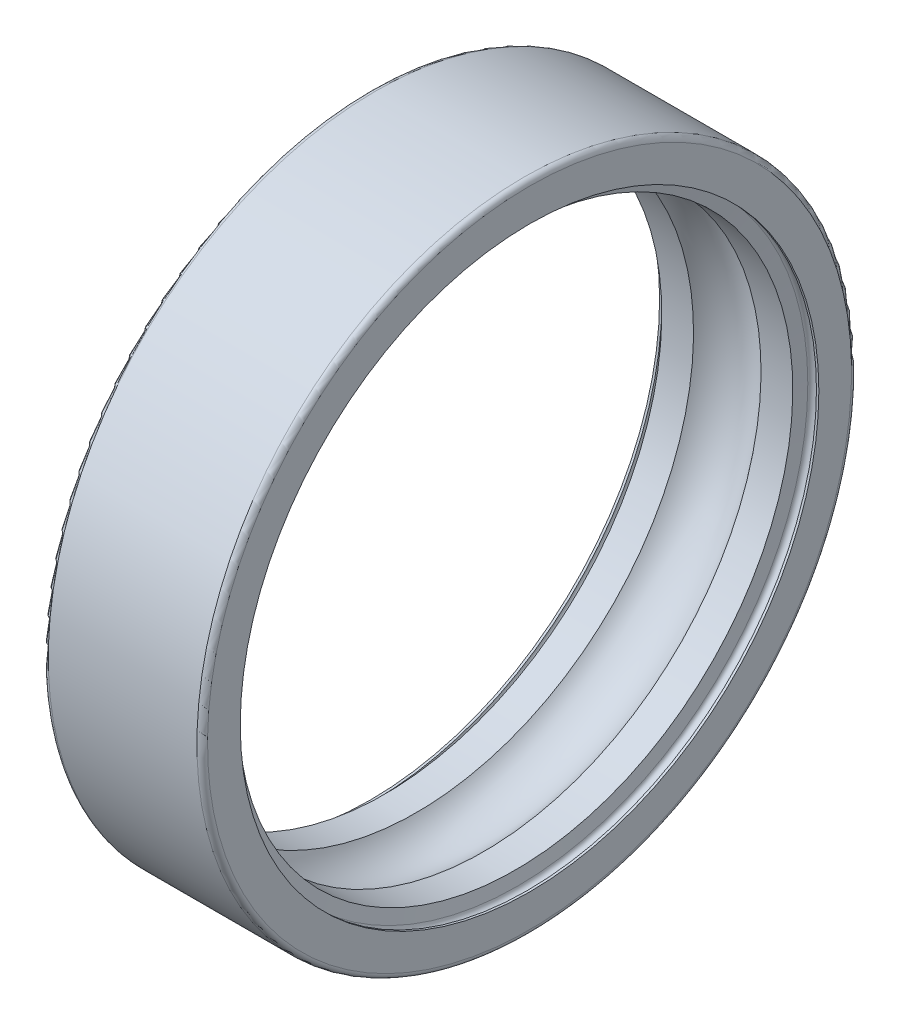
ISO-10303-21;
HEADER;
FILE_DESCRIPTION(('STEP AP214'),'2;1');
FILE_NAME('part.step','',(''),(''),'','','');
FILE_SCHEMA(('AUTOMOTIVE_DESIGN { 1 0 10303 214 1 1 1 1 }'));
ENDSEC;
DATA;
#1=APPLICATION_CONTEXT('core data for automotive mechanical design processes');
#2=APPLICATION_PROTOCOL_DEFINITION('international standard','automotive_design',2000,#1);
#3=PRODUCT_CONTEXT('',#1,'mechanical');
#4=PRODUCT('Part','Part','',(#3));
#5=PRODUCT_RELATED_PRODUCT_CATEGORY('part','',(#4));
#6=PRODUCT_DEFINITION_FORMATION('','',#4);
#7=PRODUCT_DEFINITION_CONTEXT('part definition',#1,'design');
#8=PRODUCT_DEFINITION('design','',#6,#7);
#9=PRODUCT_DEFINITION_SHAPE('','',#8);
#10=(LENGTH_UNIT() NAMED_UNIT(*) SI_UNIT(.MILLI.,.METRE.));
#11=(NAMED_UNIT(*) PLANE_ANGLE_UNIT() SI_UNIT($,.RADIAN.));
#12=(NAMED_UNIT(*) SI_UNIT($,.STERADIAN.) SOLID_ANGLE_UNIT());
#13=UNCERTAINTY_MEASURE_WITH_UNIT(LENGTH_MEASURE(1.E-05),#10,'distance_accuracy_value','');
#14=(GEOMETRIC_REPRESENTATION_CONTEXT(3) GLOBAL_UNCERTAINTY_ASSIGNED_CONTEXT((#13)) GLOBAL_UNIT_ASSIGNED_CONTEXT((#10,
#11,#12)) REPRESENTATION_CONTEXT('',''));
#15=CARTESIAN_POINT('',(0.,0.,0.));
#16=DIRECTION('',(0.,0.,1.));
#17=DIRECTION('',(1.,0.,0.));
#18=AXIS2_PLACEMENT_3D('',#15,#16,#17);
#19=CARTESIAN_POINT('',(8.595,0.,0.));
#20=DIRECTION('',(1.,0.,0.));
#21=DIRECTION('',(0.,0.,-1.));
#22=AXIS2_PLACEMENT_3D('',#19,#20,#21);
#23=TOROIDAL_SURFACE('',#22,16.35,0.27);
#24=CARTESIAN_POINT('',(8.865,0.,0.));
#25=DIRECTION('',(1.,0.,0.));
#26=DIRECTION('',(0.,1.,0.));
#27=AXIS2_PLACEMENT_3D('',#24,#25,#26);
#28=CIRCLE('',#27,16.35);
#29=CARTESIAN_POINT('',(8.865,16.35,0.));
#30=VERTEX_POINT('',#29);
#31=EDGE_CURVE('E11',#30,#30,#28,.T.);
#32=ORIENTED_EDGE('',*,*,#31,.T.);
#33=EDGE_LOOP('',(#32));
#34=FACE_BOUND('',#33,.T.);
#35=CARTESIAN_POINT('',(8.3291019066867,0.,0.));
#36=DIRECTION('',(1.,0.,0.));
#37=DIRECTION('',(0.,1.,0.));
#38=AXIS2_PLACEMENT_3D('',#35,#36,#37);
#39=CIRCLE('',#38,16.3968850079701);
#40=CARTESIAN_POINT('',(8.3291019066867,16.3968850079701,0.));
#41=VERTEX_POINT('',#40);
#42=EDGE_CURVE('E77',#41,#41,#39,.T.);
#43=ORIENTED_EDGE('',*,*,#42,.F.);
#44=EDGE_LOOP('',(#43));
#45=FACE_BOUND('',#44,.T.);
#46=ADVANCED_FACE('F17',(#34,#45),#23,.F.);
#47=CARTESIAN_POINT('',(8.9325,0.,0.));
#48=DIRECTION('',(-1.,0.,0.));
#49=DIRECTION('',(0.,1.,0.));
#50=AXIS2_PLACEMENT_3D('',#47,#48,#49);
#51=CYLINDRICAL_SURFACE('',#50,16.35);
#52=CARTESIAN_POINT('',(9.,0.,0.));
#53=DIRECTION('',(1.,0.,0.));
#54=DIRECTION('',(0.,1.,0.));
#55=AXIS2_PLACEMENT_3D('',#52,#53,#54);
#56=CIRCLE('',#55,16.35);
#57=CARTESIAN_POINT('',(9.,16.35,0.));
#58=VERTEX_POINT('',#57);
#59=EDGE_CURVE('E26',#58,#58,#56,.T.);
#60=ORIENTED_EDGE('',*,*,#59,.T.);
#61=EDGE_LOOP('',(#60));
#62=FACE_BOUND('',#61,.T.);
#63=ORIENTED_EDGE('',*,*,#31,.F.);
#64=EDGE_LOOP('',(#63));
#65=FACE_BOUND('',#64,.T.);
#66=ADVANCED_FACE('F123',(#62,#65),#51,.F.);
#67=CARTESIAN_POINT('',(9.,17.275,0.));
#68=DIRECTION('',(1.,0.,0.));
#69=DIRECTION('',(0.,1.,0.));
#70=AXIS2_PLACEMENT_3D('',#67,#68,#69);
#71=PLANE('',#70);
#72=CARTESIAN_POINT('',(9.,0.,0.));
#73=DIRECTION('',(1.,0.,0.));
#74=DIRECTION('',(0.,1.,0.));
#75=AXIS2_PLACEMENT_3D('',#72,#73,#74);
#76=CIRCLE('',#75,18.2);
#77=CARTESIAN_POINT('',(9.,18.2,0.));
#78=VERTEX_POINT('',#77);
#79=EDGE_CURVE('E20',#78,#78,#76,.T.);
#80=ORIENTED_EDGE('',*,*,#79,.T.);
#81=EDGE_LOOP('',(#80));
#82=FACE_BOUND('',#81,.T.);
#83=ORIENTED_EDGE('',*,*,#59,.F.);
#84=EDGE_LOOP('',(#83));
#85=FACE_BOUND('',#84,.T.);
#86=ADVANCED_FACE('F64',(#82,#85),#71,.T.);
#87=CARTESIAN_POINT('',(8.7,0.,0.));
#88=DIRECTION('',(1.,0.,0.));
#89=DIRECTION('',(0.,0.,-1.));
#90=AXIS2_PLACEMENT_3D('',#87,#88,#89);
#91=TOROIDAL_SURFACE('',#90,18.2,0.3);
#92=CARTESIAN_POINT('',(8.7,0.,0.));
#93=DIRECTION('',(1.,0.,0.));
#94=DIRECTION('',(0.,1.,0.));
#95=AXIS2_PLACEMENT_3D('',#92,#93,#94);
#96=CIRCLE('',#95,18.5);
#97=CARTESIAN_POINT('',(8.7,18.5,0.));
#98=VERTEX_POINT('',#97);
#99=EDGE_CURVE('E67',#98,#98,#96,.T.);
#100=ORIENTED_EDGE('',*,*,#99,.T.);
#101=EDGE_LOOP('',(#100));
#102=FACE_BOUND('',#101,.T.);
#103=ORIENTED_EDGE('',*,*,#79,.F.);
#104=EDGE_LOOP('',(#103));
#105=FACE_BOUND('',#104,.T.);
#106=ADVANCED_FACE('F133',(#102,#105),#91,.T.);
#107=CARTESIAN_POINT('',(4.5,0.,0.));
#108=DIRECTION('',(-1.,0.,0.));
#109=DIRECTION('',(0.,1.,0.));
#110=AXIS2_PLACEMENT_3D('',#107,#108,#109);
#111=CYLINDRICAL_SURFACE('',#110,18.5);
#112=CARTESIAN_POINT('',(0.3,0.,0.));
#113=DIRECTION('',(1.,0.,0.));
#114=DIRECTION('',(0.,1.,0.));
#115=AXIS2_PLACEMENT_3D('',#112,#113,#114);
#116=CIRCLE('',#115,18.5);
#117=CARTESIAN_POINT('',(0.3,18.5,0.));
#118=VERTEX_POINT('',#117);
#119=EDGE_CURVE('E69',#118,#118,#116,.T.);
#120=ORIENTED_EDGE('',*,*,#119,.T.);
#121=EDGE_LOOP('',(#120));
#122=FACE_BOUND('',#121,.T.);
#123=ORIENTED_EDGE('',*,*,#99,.F.);
#124=EDGE_LOOP('',(#123));
#125=FACE_BOUND('',#124,.T.);
#126=ADVANCED_FACE('F119',(#122,#125),#111,.T.);
#127=CARTESIAN_POINT('',(0.3,0.,0.));
#128=DIRECTION('',(1.,0.,0.));
#129=DIRECTION('',(0.,0.,-1.));
#130=AXIS2_PLACEMENT_3D('',#127,#128,#129);
#131=TOROIDAL_SURFACE('',#130,18.2,0.3);
#132=CARTESIAN_POINT('',(0.,0.,0.));
#133=DIRECTION('',(1.,0.,0.));
#134=DIRECTION('',(0.,1.,0.));
#135=AXIS2_PLACEMENT_3D('',#132,#133,#134);
#136=CIRCLE('',#135,18.2);
#137=CARTESIAN_POINT('',(0.,18.2,0.));
#138=VERTEX_POINT('',#137);
#139=EDGE_CURVE('E73',#138,#138,#136,.T.);
#140=ORIENTED_EDGE('',*,*,#139,.T.);
#141=EDGE_LOOP('',(#140));
#142=FACE_BOUND('',#141,.T.);
#143=ORIENTED_EDGE('',*,*,#119,.F.);
#144=EDGE_LOOP('',(#143));
#145=FACE_BOUND('',#144,.T.);
#146=ADVANCED_FACE('F104',(#142,#145),#131,.T.);
#147=CARTESIAN_POINT('',(0.,17.275,0.));
#148=DIRECTION('',(-1.,0.,0.));
#149=DIRECTION('',(0.,-1.,0.));
#150=AXIS2_PLACEMENT_3D('',#147,#148,#149);
#151=PLANE('',#150);
#152=CARTESIAN_POINT('',(0.,0.,0.));
#153=DIRECTION('',(1.,0.,0.));
#154=DIRECTION('',(0.,1.,0.));
#155=AXIS2_PLACEMENT_3D('',#152,#153,#154);
#156=CIRCLE('',#155,16.35);
#157=CARTESIAN_POINT('',(0.,16.35,0.));
#158=VERTEX_POINT('',#157);
#159=EDGE_CURVE('E94',#158,#158,#156,.T.);
#160=ORIENTED_EDGE('',*,*,#159,.T.);
#161=EDGE_LOOP('',(#160));
#162=FACE_BOUND('',#161,.T.);
#163=ORIENTED_EDGE('',*,*,#139,.F.);
#164=EDGE_LOOP('',(#163));
#165=FACE_BOUND('',#164,.T.);
#166=ADVANCED_FACE('F108',(#162,#165),#151,.T.);
#167=CARTESIAN_POINT('',(0.067499999999999,0.,0.));
#168=DIRECTION('',(-1.,0.,0.));
#169=DIRECTION('',(0.,1.,0.));
#170=AXIS2_PLACEMENT_3D('',#167,#168,#169);
#171=CYLINDRICAL_SURFACE('',#170,16.35);
#172=CARTESIAN_POINT('',(0.135,0.,0.));
#173=DIRECTION('',(1.,0.,0.));
#174=DIRECTION('',(0.,1.,0.));
#175=AXIS2_PLACEMENT_3D('',#172,#173,#174);
#176=CIRCLE('',#175,16.35);
#177=CARTESIAN_POINT('',(0.135,16.35,0.));
#178=VERTEX_POINT('',#177);
#179=EDGE_CURVE('E91',#178,#178,#176,.T.);
#180=ORIENTED_EDGE('',*,*,#179,.T.);
#181=EDGE_LOOP('',(#180));
#182=FACE_BOUND('',#181,.T.);
#183=ORIENTED_EDGE('',*,*,#159,.F.);
#184=EDGE_LOOP('',(#183));
#185=FACE_BOUND('',#184,.T.);
#186=ADVANCED_FACE('F110',(#182,#185),#171,.F.);
#187=CARTESIAN_POINT('',(0.405,0.,0.));
#188=DIRECTION('',(1.,0.,0.));
#189=DIRECTION('',(0.,0.,-1.));
#190=AXIS2_PLACEMENT_3D('',#187,#188,#189);
#191=TOROIDAL_SURFACE('',#190,16.35,0.27);
#192=CARTESIAN_POINT('',(0.670898093313296,0.,0.));
#193=DIRECTION('',(1.,0.,0.));
#194=DIRECTION('',(0.,1.,0.));
#195=AXIS2_PLACEMENT_3D('',#192,#193,#194);
#196=CIRCLE('',#195,16.3968850079701);
#197=CARTESIAN_POINT('',(0.670898093313297,16.3968850079701,0.));
#198=VERTEX_POINT('',#197);
#199=EDGE_CURVE('E88',#198,#198,#196,.T.);
#200=ORIENTED_EDGE('',*,*,#199,.T.);
#201=EDGE_LOOP('',(#200));
#202=FACE_BOUND('',#201,.T.);
#203=ORIENTED_EDGE('',*,*,#179,.F.);
#204=EDGE_LOOP('',(#203));
#205=FACE_BOUND('',#204,.T.);
#206=ADVANCED_FACE('F117',(#202,#205),#191,.F.);
#207=CARTESIAN_POINT('',(0.734541995250332,0.,0.));
#208=DIRECTION('',(-1.,0.,0.));
#209=DIRECTION('',(0.,1.,0.));
#210=AXIS2_PLACEMENT_3D('',#207,#208,#209);
#211=CONICAL_SURFACE('',#210,16.035942503985,1.39626340159546);
#212=CARTESIAN_POINT('',(0.798185897187366,0.,0.));
#213=DIRECTION('',(1.,0.,0.));
#214=DIRECTION('',(0.,1.,0.));
#215=AXIS2_PLACEMENT_3D('',#212,#213,#214);
#216=CIRCLE('',#215,15.675);
#217=CARTESIAN_POINT('',(0.798185897187366,15.675,0.));
#218=VERTEX_POINT('',#217);
#219=EDGE_CURVE('E92',#218,#218,#216,.T.);
#220=ORIENTED_EDGE('',*,*,#219,.T.);
#221=EDGE_LOOP('',(#220));
#222=FACE_BOUND('',#221,.T.);
#223=ORIENTED_EDGE('',*,*,#199,.F.);
#224=EDGE_LOOP('',(#223));
#225=FACE_BOUND('',#224,.T.);
#226=ADVANCED_FACE('F139',(#222,#225),#211,.F.);
#227=CARTESIAN_POINT('',(1.69534560259475,0.,0.));
#228=DIRECTION('',(-1.,0.,0.));
#229=DIRECTION('',(0.,1.,0.));
#230=AXIS2_PLACEMENT_3D('',#227,#228,#229);
#231=CYLINDRICAL_SURFACE('',#230,15.675);
#232=CARTESIAN_POINT('',(2.59250530800214,0.,0.));
#233=DIRECTION('',(1.,0.,0.));
#234=DIRECTION('',(0.,1.,0.));
#235=AXIS2_PLACEMENT_3D('',#232,#233,#234);
#236=CIRCLE('',#235,15.675);
#237=CARTESIAN_POINT('',(2.59250530800214,15.675,0.));
#238=VERTEX_POINT('',#237);
#239=EDGE_CURVE('E76',#238,#238,#236,.T.);
#240=ORIENTED_EDGE('',*,*,#239,.T.);
#241=EDGE_LOOP('',(#240));
#242=FACE_BOUND('',#241,.T.);
#243=ORIENTED_EDGE('',*,*,#219,.F.);
#244=EDGE_LOOP('',(#243));
#245=FACE_BOUND('',#244,.T.);
#246=ADVANCED_FACE('F142',(#242,#245),#231,.F.);
#247=CARTESIAN_POINT('',(4.5,0.,0.));
#248=DIRECTION('',(1.,0.,0.));
#249=DIRECTION('',(0.,0.,-1.));
#250=AXIS2_PLACEMENT_3D('',#247,#248,#249);
#251=TOROIDAL_SURFACE('',#250,14.25,2.381);
#252=CARTESIAN_POINT('',(6.40749469199786,0.,0.));
#253=DIRECTION('',(1.,0.,0.));
#254=DIRECTION('',(0.,1.,0.));
#255=AXIS2_PLACEMENT_3D('',#252,#253,#254);
#256=CIRCLE('',#255,15.675);
#257=CARTESIAN_POINT('',(6.40749469199786,15.675,0.));
#258=VERTEX_POINT('',#257);
#259=EDGE_CURVE('E78',#258,#258,#256,.T.);
#260=ORIENTED_EDGE('',*,*,#259,.T.);
#261=EDGE_LOOP('',(#260));
#262=FACE_BOUND('',#261,.T.);
#263=ORIENTED_EDGE('',*,*,#239,.F.);
#264=EDGE_LOOP('',(#263));
#265=FACE_BOUND('',#264,.T.);
#266=ADVANCED_FACE('F148',(#262,#265),#251,.F.);
#267=CARTESIAN_POINT('',(7.30465439740524,0.,0.));
#268=DIRECTION('',(-1.,0.,0.));
#269=DIRECTION('',(0.,1.,0.));
#270=AXIS2_PLACEMENT_3D('',#267,#268,#269);
#271=CYLINDRICAL_SURFACE('',#270,15.675);
#272=CARTESIAN_POINT('',(8.20181410281263,0.,0.));
#273=DIRECTION('',(1.,0.,0.));
#274=DIRECTION('',(0.,1.,0.));
#275=AXIS2_PLACEMENT_3D('',#272,#273,#274);
#276=CIRCLE('',#275,15.675);
#277=CARTESIAN_POINT('',(8.20181410281263,15.675,0.));
#278=VERTEX_POINT('',#277);
#279=EDGE_CURVE('E79',#278,#278,#276,.T.);
#280=ORIENTED_EDGE('',*,*,#279,.T.);
#281=EDGE_LOOP('',(#280));
#282=FACE_BOUND('',#281,.T.);
#283=ORIENTED_EDGE('',*,*,#259,.F.);
#284=EDGE_LOOP('',(#283));
#285=FACE_BOUND('',#284,.T.);
#286=ADVANCED_FACE('F144',(#282,#285),#271,.F.);
#287=CARTESIAN_POINT('',(8.26545800474967,0.,0.));
#288=DIRECTION('',(1.,0.,0.));
#289=DIRECTION('',(0.,1.,0.));
#290=AXIS2_PLACEMENT_3D('',#287,#288,#289);
#291=CONICAL_SURFACE('',#290,16.035942503985,1.39626340159546);
#292=ORIENTED_EDGE('',*,*,#42,.T.);
#293=EDGE_LOOP('',(#292));
#294=FACE_BOUND('',#293,.T.);
#295=ORIENTED_EDGE('',*,*,#279,.F.);
#296=EDGE_LOOP('',(#295));
#297=FACE_BOUND('',#296,.T.);
#298=ADVANCED_FACE('F147',(#294,#297),#291,.F.);
#299=CLOSED_SHELL('',(#46,#66,#86,#106,#126,#146,#166,#186,#206,#226,#246,#266,#286,#298));
#300=MANIFOLD_SOLID_BREP('B1',#299);
#301=ADVANCED_BREP_SHAPE_REPRESENTATION('',(#18,#300),#14);
#302=SHAPE_DEFINITION_REPRESENTATION(#9,#301);
ENDSEC;
END-ISO-10303-21;
